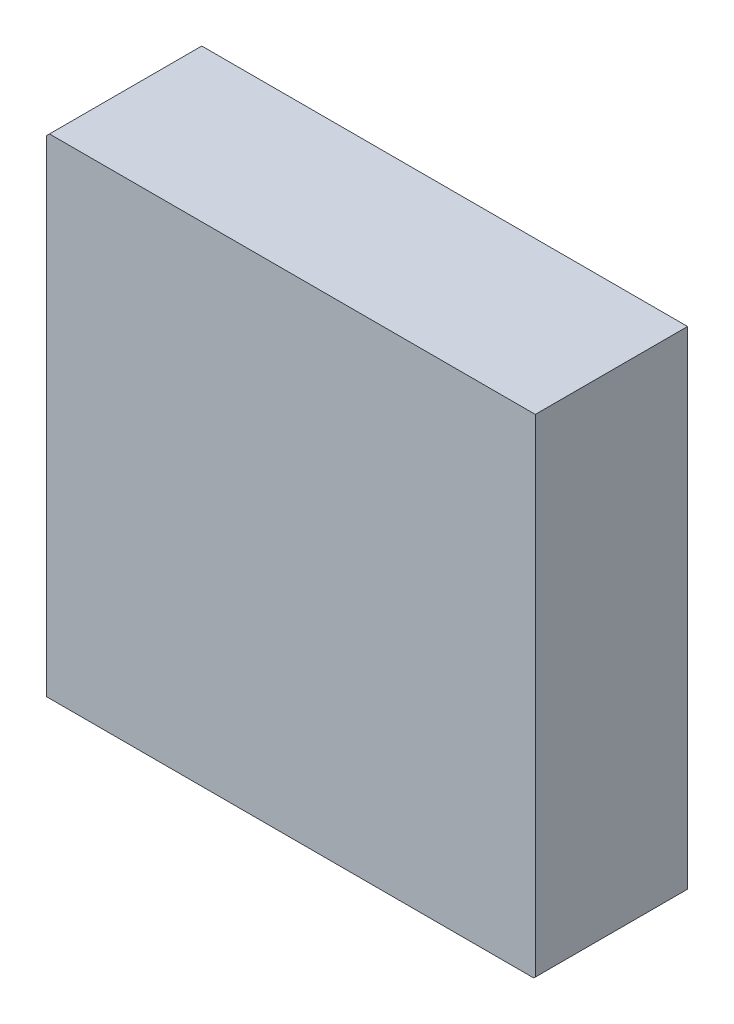
ISO-10303-21;
HEADER;
FILE_DESCRIPTION(('STEP AP214'),'2;1');
FILE_NAME('part.step','',(''),(''),'','','');
FILE_SCHEMA(('AUTOMOTIVE_DESIGN { 1 0 10303 214 1 1 1 1 }'));
ENDSEC;
DATA;
#1=APPLICATION_CONTEXT('core data for automotive mechanical design processes');
#2=APPLICATION_PROTOCOL_DEFINITION('international standard','automotive_design',2000,#1);
#3=PRODUCT_CONTEXT('',#1,'mechanical');
#4=PRODUCT('Part','Part','',(#3));
#5=PRODUCT_RELATED_PRODUCT_CATEGORY('part','',(#4));
#6=PRODUCT_DEFINITION_FORMATION('','',#4);
#7=PRODUCT_DEFINITION_CONTEXT('part definition',#1,'design');
#8=PRODUCT_DEFINITION('design','',#6,#7);
#9=PRODUCT_DEFINITION_SHAPE('','',#8);
#10=(LENGTH_UNIT() NAMED_UNIT(*) SI_UNIT(.MILLI.,.METRE.));
#11=(NAMED_UNIT(*) PLANE_ANGLE_UNIT() SI_UNIT($,.RADIAN.));
#12=(NAMED_UNIT(*) SI_UNIT($,.STERADIAN.) SOLID_ANGLE_UNIT());
#13=UNCERTAINTY_MEASURE_WITH_UNIT(LENGTH_MEASURE(1.E-05),#10,'distance_accuracy_value','');
#14=(GEOMETRIC_REPRESENTATION_CONTEXT(3) GLOBAL_UNCERTAINTY_ASSIGNED_CONTEXT((#13)) GLOBAL_UNIT_ASSIGNED_CONTEXT((#10,
#11,#12)) REPRESENTATION_CONTEXT('',''));
#15=CARTESIAN_POINT('',(0.,0.,0.));
#16=DIRECTION('',(0.,0.,1.));
#17=DIRECTION('',(1.,0.,0.));
#18=AXIS2_PLACEMENT_3D('',#15,#16,#17);
#19=CARTESIAN_POINT('',(0.79750158,-0.8025003,0.499999));
#20=DIRECTION('',(0.,0.,-1.));
#21=DIRECTION('',(-1.,0.,0.));
#22=AXIS2_PLACEMENT_3D('',#19,#20,#21);
#23=PLANE('',#22);
#24=DIRECTION('',(0.,1.,0.));
#25=VECTOR('',#24,1.);
#26=CARTESIAN_POINT('',(0.8025003,-0.79750158,0.499999));
#27=LINE('',#26,#25);
#28=CARTESIAN_POINT('',(0.802500300000001,-0.797501580000001,0.499999));
#29=VERTEX_POINT('',#28);
#30=CARTESIAN_POINT('',(0.8025003,0.8025003,0.499999));
#31=VERTEX_POINT('',#30);
#32=EDGE_CURVE('E98',#29,#31,#27,.T.);
#33=ORIENTED_EDGE('',*,*,#32,.T.);
#34=DIRECTION('',(1.,0.,0.));
#35=VECTOR('',#34,1.);
#36=CARTESIAN_POINT('',(0.8025003,0.8025003,0.499999));
#37=LINE('',#36,#35);
#38=CARTESIAN_POINT('',(-0.79249778,0.8025003,0.499999));
#39=VERTEX_POINT('',#38);
#40=EDGE_CURVE('E94',#31,#39,#37,.F.);
#41=ORIENTED_EDGE('',*,*,#40,.T.);
#42=DIRECTION('',(0.707106781186548,0.707106781186548,0.));
#43=VECTOR('',#42,1.);
#44=CARTESIAN_POINT('',(-0.79249778,0.8025003,0.499999));
#45=LINE('',#44,#43);
#46=CARTESIAN_POINT('',(-0.8025003,0.79249778,0.499999));
#47=VERTEX_POINT('',#46);
#48=EDGE_CURVE('E68',#39,#47,#45,.F.);
#49=ORIENTED_EDGE('',*,*,#48,.T.);
#50=DIRECTION('',(0.,1.,0.));
#51=VECTOR('',#50,1.);
#52=CARTESIAN_POINT('',(-0.8025003,0.79249778,0.499999));
#53=LINE('',#52,#51);
#54=CARTESIAN_POINT('',(-0.8025003,-0.8025003,0.499999));
#55=VERTEX_POINT('',#54);
#56=EDGE_CURVE('E71',#47,#55,#53,.F.);
#57=ORIENTED_EDGE('',*,*,#56,.T.);
#58=DIRECTION('',(1.,0.,0.));
#59=VECTOR('',#58,1.);
#60=CARTESIAN_POINT('',(-0.8025003,-0.8025003,0.499999));
#61=LINE('',#60,#59);
#62=CARTESIAN_POINT('',(0.79750158,-0.8025003,0.499999));
#63=VERTEX_POINT('',#62);
#64=EDGE_CURVE('E73',#55,#63,#61,.T.);
#65=ORIENTED_EDGE('',*,*,#64,.T.);
#66=DIRECTION('',(-0.707106781186548,-0.707106781186548,0.));
#67=VECTOR('',#66,1.);
#68=CARTESIAN_POINT('',(0.8025003,-0.79750158,0.499999));
#69=LINE('',#68,#67);
#70=EDGE_CURVE('E20',#29,#63,#69,.T.);
#71=ORIENTED_EDGE('',*,*,#70,.F.);
#72=EDGE_LOOP('',(#33,#41,#49,#57,#65,#71));
#73=FACE_BOUND('',#72,.T.);
#74=ADVANCED_FACE('F17',(#73),#23,.F.);
#75=CARTESIAN_POINT('',(-0.8025003,-0.8025003,0.));
#76=DIRECTION('',(0.,1.,0.));
#77=DIRECTION('',(0.,0.,1.));
#78=AXIS2_PLACEMENT_3D('',#75,#76,#77);
#79=PLANE('',#78);
#80=DIRECTION('',(0.,0.,1.));
#81=VECTOR('',#80,1.);
#82=CARTESIAN_POINT('',(0.79750158,-0.8025003,0.));
#83=LINE('',#82,#81);
#84=CARTESIAN_POINT('',(0.79750158,-0.8025003,0.));
#85=VERTEX_POINT('',#84);
#86=EDGE_CURVE('E84',#85,#63,#83,.T.);
#87=ORIENTED_EDGE('',*,*,#86,.T.);
#88=ORIENTED_EDGE('',*,*,#64,.F.);
#89=DIRECTION('',(0.,0.,-1.));
#90=VECTOR('',#89,1.);
#91=CARTESIAN_POINT('',(-0.8025003,-0.8025003,0.));
#92=LINE('',#91,#90);
#93=CARTESIAN_POINT('',(-0.8025003,-0.8025003,0.));
#94=VERTEX_POINT('',#93);
#95=EDGE_CURVE('E78',#55,#94,#92,.T.);
#96=ORIENTED_EDGE('',*,*,#95,.T.);
#97=DIRECTION('',(-1.,0.,0.));
#98=VECTOR('',#97,1.);
#99=CARTESIAN_POINT('',(0.79750158,-0.8025003,0.));
#100=LINE('',#99,#98);
#101=EDGE_CURVE('E104',#85,#94,#100,.T.);
#102=ORIENTED_EDGE('',*,*,#101,.F.);
#103=EDGE_LOOP('',(#87,#88,#96,#102));
#104=FACE_BOUND('',#103,.T.);
#105=ADVANCED_FACE('F81',(#104),#79,.F.);
#106=CARTESIAN_POINT('',(-0.8025003,0.79249778,0.));
#107=DIRECTION('',(1.,0.,0.));
#108=DIRECTION('',(0.,0.,-1.));
#109=AXIS2_PLACEMENT_3D('',#106,#107,#108);
#110=PLANE('',#109);
#111=ORIENTED_EDGE('',*,*,#95,.F.);
#112=ORIENTED_EDGE('',*,*,#56,.F.);
#113=DIRECTION('',(0.,0.,1.));
#114=VECTOR('',#113,1.);
#115=CARTESIAN_POINT('',(-0.8025003,0.79249778,0.));
#116=LINE('',#115,#114);
#117=CARTESIAN_POINT('',(-0.8025003,0.79249778,0.));
#118=VERTEX_POINT('',#117);
#119=EDGE_CURVE('E90',#47,#118,#116,.F.);
#120=ORIENTED_EDGE('',*,*,#119,.T.);
#121=DIRECTION('',(0.,1.,0.));
#122=VECTOR('',#121,1.);
#123=CARTESIAN_POINT('',(-0.8025003,-0.8025003,0.));
#124=LINE('',#123,#122);
#125=EDGE_CURVE('E87',#94,#118,#124,.T.);
#126=ORIENTED_EDGE('',*,*,#125,.F.);
#127=EDGE_LOOP('',(#111,#112,#120,#126));
#128=FACE_BOUND('',#127,.T.);
#129=ADVANCED_FACE('F85',(#128),#110,.F.);
#130=CARTESIAN_POINT('',(-0.79249778,0.8025003,0.));
#131=DIRECTION('',(0.707106781186548,-0.707106781186548,0.));
#132=DIRECTION('',(0.707106781186548,0.707106781186548,0.));
#133=AXIS2_PLACEMENT_3D('',#130,#131,#132);
#134=PLANE('',#133);
#135=ORIENTED_EDGE('',*,*,#119,.F.);
#136=ORIENTED_EDGE('',*,*,#48,.F.);
#137=DIRECTION('',(0.,0.,-1.));
#138=VECTOR('',#137,1.);
#139=CARTESIAN_POINT('',(-0.79249778,0.8025003,0.));
#140=LINE('',#139,#138);
#141=CARTESIAN_POINT('',(-0.79249778,0.8025003,0.));
#142=VERTEX_POINT('',#141);
#143=EDGE_CURVE('E96',#39,#142,#140,.T.);
#144=ORIENTED_EDGE('',*,*,#143,.T.);
#145=DIRECTION('',(0.707106781186548,0.707106781186548,0.));
#146=VECTOR('',#145,1.);
#147=CARTESIAN_POINT('',(-0.8025003,0.79249778,0.));
#148=LINE('',#147,#146);
#149=EDGE_CURVE('E107',#118,#142,#148,.T.);
#150=ORIENTED_EDGE('',*,*,#149,.F.);
#151=EDGE_LOOP('',(#135,#136,#144,#150));
#152=FACE_BOUND('',#151,.T.);
#153=ADVANCED_FACE('F124',(#152),#134,.F.);
#154=CARTESIAN_POINT('',(0.8025003,0.8025003,0.));
#155=DIRECTION('',(0.,-1.,0.));
#156=DIRECTION('',(0.,0.,-1.));
#157=AXIS2_PLACEMENT_3D('',#154,#155,#156);
#158=PLANE('',#157);
#159=ORIENTED_EDGE('',*,*,#143,.F.);
#160=ORIENTED_EDGE('',*,*,#40,.F.);
#161=DIRECTION('',(0.,0.,1.));
#162=VECTOR('',#161,1.);
#163=CARTESIAN_POINT('',(0.8025003,0.8025003,0.));
#164=LINE('',#163,#162);
#165=CARTESIAN_POINT('',(0.8025003,0.8025003,0.));
#166=VERTEX_POINT('',#165);
#167=EDGE_CURVE('E100',#31,#166,#164,.F.);
#168=ORIENTED_EDGE('',*,*,#167,.T.);
#169=DIRECTION('',(-1.,0.,0.));
#170=VECTOR('',#169,1.);
#171=CARTESIAN_POINT('',(0.79750158,0.8025003,0.));
#172=LINE('',#171,#170);
#173=EDGE_CURVE('E110',#142,#166,#172,.F.);
#174=ORIENTED_EDGE('',*,*,#173,.F.);
#175=EDGE_LOOP('',(#159,#160,#168,#174));
#176=FACE_BOUND('',#175,.T.);
#177=ADVANCED_FACE('F122',(#176),#158,.F.);
#178=CARTESIAN_POINT('',(0.8025003,-0.79750158,0.));
#179=DIRECTION('',(-1.,0.,0.));
#180=DIRECTION('',(0.,0.,1.));
#181=AXIS2_PLACEMENT_3D('',#178,#179,#180);
#182=PLANE('',#181);
#183=ORIENTED_EDGE('',*,*,#167,.F.);
#184=ORIENTED_EDGE('',*,*,#32,.F.);
#185=DIRECTION('',(0.,0.,1.));
#186=VECTOR('',#185,1.);
#187=CARTESIAN_POINT('',(0.802500300000004,-0.797501580000004,0.));
#188=LINE('',#187,#186);
#189=CARTESIAN_POINT('',(0.802500300000001,-0.797501580000001,0.));
#190=VERTEX_POINT('',#189);
#191=EDGE_CURVE('E35',#29,#190,#188,.F.);
#192=ORIENTED_EDGE('',*,*,#191,.T.);
#193=DIRECTION('',(0.,1.,0.));
#194=VECTOR('',#193,1.);
#195=CARTESIAN_POINT('',(0.8025003,-0.8025003,0.));
#196=LINE('',#195,#194);
#197=EDGE_CURVE('E26',#166,#190,#196,.F.);
#198=ORIENTED_EDGE('',*,*,#197,.F.);
#199=EDGE_LOOP('',(#183,#184,#192,#198));
#200=FACE_BOUND('',#199,.T.);
#201=ADVANCED_FACE('F118',(#200),#182,.F.);
#202=CARTESIAN_POINT('',(0.79750158,-0.8025003,0.));
#203=DIRECTION('',(-0.707106781186048,0.707106781187048,0.));
#204=DIRECTION('',(-0.707106781187048,-0.707106781186048,0.));
#205=AXIS2_PLACEMENT_3D('',#202,#203,#204);
#206=PLANE('',#205);
#207=ORIENTED_EDGE('',*,*,#191,.F.);
#208=ORIENTED_EDGE('',*,*,#70,.T.);
#209=ORIENTED_EDGE('',*,*,#86,.F.);
#210=DIRECTION('',(-0.707106781186548,-0.707106781186548,0.));
#211=VECTOR('',#210,1.);
#212=CARTESIAN_POINT('',(0.8025003,-0.79750158,0.));
#213=LINE('',#212,#211);
#214=EDGE_CURVE('E11',#190,#85,#213,.T.);
#215=ORIENTED_EDGE('',*,*,#214,.F.);
#216=EDGE_LOOP('',(#207,#208,#209,#215));
#217=FACE_BOUND('',#216,.T.);
#218=ADVANCED_FACE('F127',(#217),#206,.F.);
#219=CARTESIAN_POINT('',(0.79750158,-0.8025003,0.));
#220=DIRECTION('',(0.,0.,-1.));
#221=DIRECTION('',(-1.,0.,0.));
#222=AXIS2_PLACEMENT_3D('',#219,#220,#221);
#223=PLANE('',#222);
#224=ORIENTED_EDGE('',*,*,#197,.T.);
#225=ORIENTED_EDGE('',*,*,#214,.T.);
#226=ORIENTED_EDGE('',*,*,#101,.T.);
#227=ORIENTED_EDGE('',*,*,#125,.T.);
#228=ORIENTED_EDGE('',*,*,#149,.T.);
#229=ORIENTED_EDGE('',*,*,#173,.T.);
#230=EDGE_LOOP('',(#224,#225,#226,#227,#228,#229));
#231=FACE_BOUND('',#230,.T.);
#232=ADVANCED_FACE('F115',(#231),#223,.T.);
#233=CLOSED_SHELL('',(#74,#105,#129,#153,#177,#201,#218,#232));
#234=MANIFOLD_SOLID_BREP('B1',#233);
#235=ADVANCED_BREP_SHAPE_REPRESENTATION('',(#18,#234),#14);
#236=SHAPE_DEFINITION_REPRESENTATION(#9,#235);
ENDSEC;
END-ISO-10303-21;
